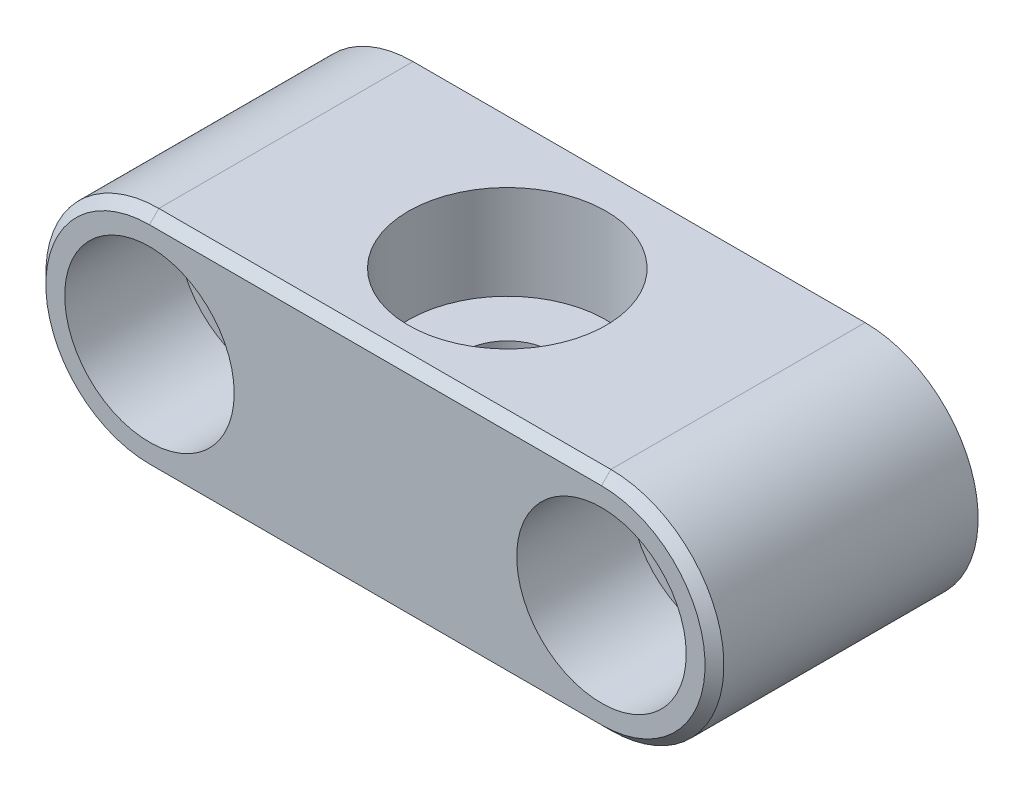
ISO-10303-21;
HEADER;
FILE_DESCRIPTION(('STEP AP214'),'2;1');
FILE_NAME('part.step','',(''),(''),'','','');
FILE_SCHEMA(('AUTOMOTIVE_DESIGN { 1 0 10303 214 1 1 1 1 }'));
ENDSEC;
DATA;
#1=APPLICATION_CONTEXT('core data for automotive mechanical design processes');
#2=APPLICATION_PROTOCOL_DEFINITION('international standard','automotive_design',2000,#1);
#3=PRODUCT_CONTEXT('',#1,'mechanical');
#4=PRODUCT('Part','Part','',(#3));
#5=PRODUCT_RELATED_PRODUCT_CATEGORY('part','',(#4));
#6=PRODUCT_DEFINITION_FORMATION('','',#4);
#7=PRODUCT_DEFINITION_CONTEXT('part definition',#1,'design');
#8=PRODUCT_DEFINITION('design','',#6,#7);
#9=PRODUCT_DEFINITION_SHAPE('','',#8);
#10=(LENGTH_UNIT() NAMED_UNIT(*) SI_UNIT(.MILLI.,.METRE.));
#11=(NAMED_UNIT(*) PLANE_ANGLE_UNIT() SI_UNIT($,.RADIAN.));
#12=(NAMED_UNIT(*) SI_UNIT($,.STERADIAN.) SOLID_ANGLE_UNIT());
#13=UNCERTAINTY_MEASURE_WITH_UNIT(LENGTH_MEASURE(1.E-05),#10,'distance_accuracy_value','');
#14=(GEOMETRIC_REPRESENTATION_CONTEXT(3) GLOBAL_UNCERTAINTY_ASSIGNED_CONTEXT((#13)) GLOBAL_UNIT_ASSIGNED_CONTEXT((#10,
#11,#12)) REPRESENTATION_CONTEXT('',''));
#15=CARTESIAN_POINT('',(0.,0.,0.));
#16=DIRECTION('',(0.,0.,1.));
#17=DIRECTION('',(1.,0.,0.));
#18=AXIS2_PLACEMENT_3D('',#15,#16,#17);
#19=CARTESIAN_POINT('',(12.,0.,7.));
#20=DIRECTION('',(0.,0.,-1.));
#21=DIRECTION('',(-1.,0.,0.));
#22=AXIS2_PLACEMENT_3D('',#19,#20,#21);
#23=CYLINDRICAL_SURFACE('',#22,2.75);
#24=CARTESIAN_POINT('',(12.,0.,-7.));
#25=DIRECTION('',(0.,0.,1.));
#26=DIRECTION('',(1.,0.,0.));
#27=AXIS2_PLACEMENT_3D('',#24,#25,#26);
#28=CIRCLE('',#27,2.75);
#29=CARTESIAN_POINT('',(14.75,0.,-7.));
#30=VERTEX_POINT('',#29);
#31=EDGE_CURVE('E111',#30,#30,#28,.T.);
#32=ORIENTED_EDGE('',*,*,#31,.F.);
#33=EDGE_LOOP('',(#32));
#34=FACE_BOUND('',#33,.T.);
#35=CARTESIAN_POINT('',(12.,0.,1.));
#36=DIRECTION('',(0.,0.,1.));
#37=DIRECTION('',(1.,0.,0.));
#38=AXIS2_PLACEMENT_3D('',#35,#36,#37);
#39=CIRCLE('',#38,2.75);
#40=CARTESIAN_POINT('',(14.75,0.,1.));
#41=VERTEX_POINT('',#40);
#42=EDGE_CURVE('E37',#41,#41,#39,.T.);
#43=ORIENTED_EDGE('',*,*,#42,.T.);
#44=EDGE_LOOP('',(#43));
#45=FACE_BOUND('',#44,.T.);
#46=ADVANCED_FACE('F33',(#34,#45),#23,.F.);
#47=CARTESIAN_POINT('',(-12.,0.,7.));
#48=DIRECTION('',(0.,0.,-1.));
#49=DIRECTION('',(-1.,0.,0.));
#50=AXIS2_PLACEMENT_3D('',#47,#48,#49);
#51=CYLINDRICAL_SURFACE('',#50,2.75);
#52=CARTESIAN_POINT('',(-12.,0.,-7.));
#53=DIRECTION('',(0.,0.,1.));
#54=DIRECTION('',(1.,0.,0.));
#55=AXIS2_PLACEMENT_3D('',#52,#53,#54);
#56=CIRCLE('',#55,2.75);
#57=CARTESIAN_POINT('',(-9.24999999999999,0.,-7.));
#58=VERTEX_POINT('',#57);
#59=EDGE_CURVE('E108',#58,#58,#56,.T.);
#60=ORIENTED_EDGE('',*,*,#59,.F.);
#61=EDGE_LOOP('',(#60));
#62=FACE_BOUND('',#61,.T.);
#63=CARTESIAN_POINT('',(-12.,0.,1.));
#64=DIRECTION('',(0.,0.,1.));
#65=DIRECTION('',(1.,0.,0.));
#66=AXIS2_PLACEMENT_3D('',#63,#64,#65);
#67=CIRCLE('',#66,2.75);
#68=CARTESIAN_POINT('',(-9.24999999999999,0.,1.));
#69=VERTEX_POINT('',#68);
#70=EDGE_CURVE('E144',#69,#69,#67,.T.);
#71=ORIENTED_EDGE('',*,*,#70,.T.);
#72=EDGE_LOOP('',(#71));
#73=FACE_BOUND('',#72,.T.);
#74=ADVANCED_FACE('F178',(#62,#73),#51,.F.);
#75=CARTESIAN_POINT('',(0.,-6.00000000000001,0.));
#76=DIRECTION('',(0.,1.,0.));
#77=DIRECTION('',(-1.,0.,0.));
#78=AXIS2_PLACEMENT_3D('',#75,#76,#77);
#79=CYLINDRICAL_SURFACE('',#78,2.35);
#80=CARTESIAN_POINT('',(0.,-6.00000000000001,0.));
#81=DIRECTION('',(0.,1.,0.));
#82=DIRECTION('',(-1.,0.,0.));
#83=AXIS2_PLACEMENT_3D('',#80,#81,#82);
#84=CIRCLE('',#83,2.35);
#85=CARTESIAN_POINT('',(-2.35,-6.00000000000001,0.));
#86=VERTEX_POINT('',#85);
#87=EDGE_CURVE('E125',#86,#86,#84,.T.);
#88=ORIENTED_EDGE('',*,*,#87,.F.);
#89=EDGE_LOOP('',(#88));
#90=FACE_BOUND('',#89,.T.);
#91=CARTESIAN_POINT('',(0.,0.999999999999999,0.));
#92=DIRECTION('',(0.,1.,0.));
#93=DIRECTION('',(-1.,0.,0.));
#94=AXIS2_PLACEMENT_3D('',#91,#92,#93);
#95=CIRCLE('',#94,2.35);
#96=CARTESIAN_POINT('',(-2.35,0.999999999999999,0.));
#97=VERTEX_POINT('',#96);
#98=EDGE_CURVE('E122',#97,#97,#95,.F.);
#99=ORIENTED_EDGE('',*,*,#98,.F.);
#100=EDGE_LOOP('',(#99));
#101=FACE_BOUND('',#100,.T.);
#102=ADVANCED_FACE('F195',(#90,#101),#79,.F.);
#103=CARTESIAN_POINT('',(12.,0.,7.));
#104=DIRECTION('',(0.,0.,1.));
#105=DIRECTION('',(1.,0.,0.));
#106=AXIS2_PLACEMENT_3D('',#103,#104,#105);
#107=PLANE('',#106);
#108=CARTESIAN_POINT('',(12.,0.,7.));
#109=DIRECTION('',(0.,0.,1.));
#110=DIRECTION('',(1.,0.,0.));
#111=AXIS2_PLACEMENT_3D('',#108,#109,#110);
#112=CIRCLE('',#111,4.5);
#113=CARTESIAN_POINT('',(16.5,0.,7.));
#114=VERTEX_POINT('',#113);
#115=EDGE_CURVE('E164',#114,#114,#112,.T.);
#116=ORIENTED_EDGE('',*,*,#115,.F.);
#117=EDGE_LOOP('',(#116));
#118=FACE_BOUND('',#117,.T.);
#119=CARTESIAN_POINT('',(-12.,0.,7.));
#120=DIRECTION('',(0.,0.,1.));
#121=DIRECTION('',(1.,0.,0.));
#122=AXIS2_PLACEMENT_3D('',#119,#120,#121);
#123=CIRCLE('',#122,4.5);
#124=CARTESIAN_POINT('',(-7.5,0.,7.));
#125=VERTEX_POINT('',#124);
#126=EDGE_CURVE('E157',#125,#125,#123,.T.);
#127=ORIENTED_EDGE('',*,*,#126,.F.);
#128=EDGE_LOOP('',(#127));
#129=FACE_BOUND('',#128,.T.);
#130=CARTESIAN_POINT('',(-12.,0.,7.));
#131=DIRECTION('',(0.,0.,1.));
#132=DIRECTION('',(1.,0.,0.));
#133=AXIS2_PLACEMENT_3D('',#130,#131,#132);
#134=CIRCLE('',#133,5.5);
#135=CARTESIAN_POINT('',(-12.,5.5,7.));
#136=VERTEX_POINT('',#135);
#137=CARTESIAN_POINT('',(-12.,-5.5,7.));
#138=VERTEX_POINT('',#137);
#139=EDGE_CURVE('E128',#136,#138,#134,.T.);
#140=ORIENTED_EDGE('',*,*,#139,.T.);
#141=DIRECTION('',(1.,0.,0.));
#142=VECTOR('',#141,1.);
#143=CARTESIAN_POINT('',(12.,-5.5,7.));
#144=LINE('',#143,#142);
#145=CARTESIAN_POINT('',(12.,-5.5,7.));
#146=VERTEX_POINT('',#145);
#147=EDGE_CURVE('E132',#138,#146,#144,.T.);
#148=ORIENTED_EDGE('',*,*,#147,.T.);
#149=CARTESIAN_POINT('',(12.,0.,7.));
#150=DIRECTION('',(0.,0.,1.));
#151=DIRECTION('',(1.,0.,0.));
#152=AXIS2_PLACEMENT_3D('',#149,#150,#151);
#153=CIRCLE('',#152,5.5);
#154=CARTESIAN_POINT('',(12.,5.50000000000001,7.));
#155=VERTEX_POINT('',#154);
#156=EDGE_CURVE('E130',#146,#155,#153,.T.);
#157=ORIENTED_EDGE('',*,*,#156,.T.);
#158=DIRECTION('',(-1.,0.,0.));
#159=VECTOR('',#158,1.);
#160=CARTESIAN_POINT('',(-12.,5.5,7.));
#161=LINE('',#160,#159);
#162=EDGE_CURVE('E92',#155,#136,#161,.T.);
#163=ORIENTED_EDGE('',*,*,#162,.T.);
#164=EDGE_LOOP('',(#140,#148,#157,#163));
#165=FACE_BOUND('',#164,.T.);
#166=ADVANCED_FACE('F192',(#118,#129,#165),#107,.T.);
#167=CARTESIAN_POINT('',(12.,0.,-7.));
#168=DIRECTION('',(0.,0.,1.));
#169=DIRECTION('',(1.,0.,0.));
#170=AXIS2_PLACEMENT_3D('',#167,#168,#169);
#171=PLANE('',#170);
#172=CARTESIAN_POINT('',(12.,0.,-7.));
#173=DIRECTION('',(0.,0.,1.));
#174=DIRECTION('',(1.,0.,0.));
#175=AXIS2_PLACEMENT_3D('',#172,#173,#174);
#176=CIRCLE('',#175,6.);
#177=CARTESIAN_POINT('',(12.,-5.99999999999999,-7.));
#178=VERTEX_POINT('',#177);
#179=CARTESIAN_POINT('',(12.,6.,-7.));
#180=VERTEX_POINT('',#179);
#181=EDGE_CURVE('E100',#178,#180,#176,.T.);
#182=ORIENTED_EDGE('',*,*,#181,.F.);
#183=DIRECTION('',(1.,0.,0.));
#184=VECTOR('',#183,1.);
#185=CARTESIAN_POINT('',(12.,-5.99999999999999,-7.));
#186=LINE('',#185,#184);
#187=CARTESIAN_POINT('',(-12.,-6.,-7.));
#188=VERTEX_POINT('',#187);
#189=EDGE_CURVE('E116',#188,#178,#186,.T.);
#190=ORIENTED_EDGE('',*,*,#189,.F.);
#191=CARTESIAN_POINT('',(-12.,0.,-7.));
#192=DIRECTION('',(0.,0.,1.));
#193=DIRECTION('',(1.,0.,0.));
#194=AXIS2_PLACEMENT_3D('',#191,#192,#193);
#195=CIRCLE('',#194,6.);
#196=CARTESIAN_POINT('',(-12.,6.,-7.));
#197=VERTEX_POINT('',#196);
#198=EDGE_CURVE('E102',#197,#188,#195,.T.);
#199=ORIENTED_EDGE('',*,*,#198,.F.);
#200=DIRECTION('',(-1.,0.,0.));
#201=VECTOR('',#200,1.);
#202=CARTESIAN_POINT('',(12.,6.,-7.));
#203=LINE('',#202,#201);
#204=EDGE_CURVE('E87',#180,#197,#203,.T.);
#205=ORIENTED_EDGE('',*,*,#204,.F.);
#206=EDGE_LOOP('',(#182,#190,#199,#205));
#207=FACE_BOUND('',#206,.T.);
#208=ORIENTED_EDGE('',*,*,#59,.T.);
#209=EDGE_LOOP('',(#208));
#210=FACE_BOUND('',#209,.T.);
#211=ORIENTED_EDGE('',*,*,#31,.T.);
#212=EDGE_LOOP('',(#211));
#213=FACE_BOUND('',#212,.T.);
#214=ADVANCED_FACE('F97',(#207,#210,#213),#171,.F.);
#215=CARTESIAN_POINT('',(12.,0.,7.));
#216=DIRECTION('',(0.,0.,-1.));
#217=DIRECTION('',(-1.,0.,0.));
#218=AXIS2_PLACEMENT_3D('',#215,#216,#217);
#219=CYLINDRICAL_SURFACE('',#218,6.);
#220=DIRECTION('',(0.,0.,-1.));
#221=VECTOR('',#220,1.);
#222=CARTESIAN_POINT('',(12.,6.,7.));
#223=LINE('',#222,#221);
#224=CARTESIAN_POINT('',(12.,6.,6.5));
#225=VERTEX_POINT('',#224);
#226=EDGE_CURVE('E84',#225,#180,#223,.T.);
#227=ORIENTED_EDGE('',*,*,#226,.F.);
#228=CARTESIAN_POINT('',(12.,0.,6.5));
#229=DIRECTION('',(0.,0.,1.));
#230=DIRECTION('',(1.,0.,0.));
#231=AXIS2_PLACEMENT_3D('',#228,#229,#230);
#232=CIRCLE('',#231,6.);
#233=CARTESIAN_POINT('',(12.,-5.99999999999999,6.5));
#234=VERTEX_POINT('',#233);
#235=EDGE_CURVE('E138',#225,#234,#232,.F.);
#236=ORIENTED_EDGE('',*,*,#235,.T.);
#237=DIRECTION('',(0.,0.,-1.));
#238=VECTOR('',#237,1.);
#239=CARTESIAN_POINT('',(12.,-5.99999999999999,7.));
#240=LINE('',#239,#238);
#241=EDGE_CURVE('E106',#234,#178,#240,.T.);
#242=ORIENTED_EDGE('',*,*,#241,.T.);
#243=ORIENTED_EDGE('',*,*,#181,.T.);
#244=EDGE_LOOP('',(#227,#236,#242,#243));
#245=FACE_BOUND('',#244,.T.);
#246=ADVANCED_FACE('F104',(#245),#219,.T.);
#247=CARTESIAN_POINT('',(12.,6.,7.));
#248=DIRECTION('',(0.,-1.,0.));
#249=DIRECTION('',(1.,0.,0.));
#250=AXIS2_PLACEMENT_3D('',#247,#248,#249);
#251=PLANE('',#250);
#252=CARTESIAN_POINT('',(0.,6.,0.));
#253=DIRECTION('',(0.,1.,0.));
#254=DIRECTION('',(-1.,0.,0.));
#255=AXIS2_PLACEMENT_3D('',#252,#253,#254);
#256=CIRCLE('',#255,5.25);
#257=CARTESIAN_POINT('',(-5.25,6.,0.));
#258=VERTEX_POINT('',#257);
#259=EDGE_CURVE('E151',#258,#258,#256,.T.);
#260=ORIENTED_EDGE('',*,*,#259,.F.);
#261=EDGE_LOOP('',(#260));
#262=FACE_BOUND('',#261,.T.);
#263=DIRECTION('',(0.,0.,-1.));
#264=VECTOR('',#263,1.);
#265=CARTESIAN_POINT('',(-12.,6.,7.));
#266=LINE('',#265,#264);
#267=CARTESIAN_POINT('',(-12.,6.,6.5));
#268=VERTEX_POINT('',#267);
#269=EDGE_CURVE('E93',#268,#197,#266,.T.);
#270=ORIENTED_EDGE('',*,*,#269,.F.);
#271=DIRECTION('',(1.,0.,0.));
#272=VECTOR('',#271,1.);
#273=CARTESIAN_POINT('',(12.,6.,6.5));
#274=LINE('',#273,#272);
#275=EDGE_CURVE('E11',#268,#225,#274,.T.);
#276=ORIENTED_EDGE('',*,*,#275,.T.);
#277=ORIENTED_EDGE('',*,*,#226,.T.);
#278=ORIENTED_EDGE('',*,*,#204,.T.);
#279=EDGE_LOOP('',(#270,#276,#277,#278));
#280=FACE_BOUND('',#279,.T.);
#281=ADVANCED_FACE('F86',(#262,#280),#251,.F.);
#282=CARTESIAN_POINT('',(-12.,0.,7.));
#283=DIRECTION('',(0.,0.,-1.));
#284=DIRECTION('',(-1.,0.,0.));
#285=AXIS2_PLACEMENT_3D('',#282,#283,#284);
#286=CYLINDRICAL_SURFACE('',#285,6.);
#287=DIRECTION('',(0.,0.,-1.));
#288=VECTOR('',#287,1.);
#289=CARTESIAN_POINT('',(-12.,-6.,7.));
#290=LINE('',#289,#288);
#291=CARTESIAN_POINT('',(-12.,-6.,6.5));
#292=VERTEX_POINT('',#291);
#293=EDGE_CURVE('E119',#292,#188,#290,.T.);
#294=ORIENTED_EDGE('',*,*,#293,.F.);
#295=CARTESIAN_POINT('',(-12.,0.,6.5));
#296=DIRECTION('',(0.,0.,1.));
#297=DIRECTION('',(1.,0.,0.));
#298=AXIS2_PLACEMENT_3D('',#295,#296,#297);
#299=CIRCLE('',#298,6.);
#300=EDGE_CURVE('E42',#292,#268,#299,.F.);
#301=ORIENTED_EDGE('',*,*,#300,.T.);
#302=ORIENTED_EDGE('',*,*,#269,.T.);
#303=ORIENTED_EDGE('',*,*,#198,.T.);
#304=EDGE_LOOP('',(#294,#301,#302,#303));
#305=FACE_BOUND('',#304,.T.);
#306=ADVANCED_FACE('F217',(#305),#286,.T.);
#307=CARTESIAN_POINT('',(12.,-5.99999999999999,7.));
#308=DIRECTION('',(0.,1.,0.));
#309=DIRECTION('',(-1.,0.,0.));
#310=AXIS2_PLACEMENT_3D('',#307,#308,#309);
#311=PLANE('',#310);
#312=ORIENTED_EDGE('',*,*,#87,.T.);
#313=EDGE_LOOP('',(#312));
#314=FACE_BOUND('',#313,.T.);
#315=ORIENTED_EDGE('',*,*,#241,.F.);
#316=DIRECTION('',(-1.,0.,0.));
#317=VECTOR('',#316,1.);
#318=CARTESIAN_POINT('',(-12.,-6.,6.5));
#319=LINE('',#318,#317);
#320=EDGE_CURVE('E135',#234,#292,#319,.T.);
#321=ORIENTED_EDGE('',*,*,#320,.T.);
#322=ORIENTED_EDGE('',*,*,#293,.T.);
#323=ORIENTED_EDGE('',*,*,#189,.T.);
#324=EDGE_LOOP('',(#315,#321,#322,#323));
#325=FACE_BOUND('',#324,.T.);
#326=ADVANCED_FACE('F216',(#314,#325),#311,.F.);
#327=CARTESIAN_POINT('',(0.,0.999999999999999,0.));
#328=DIRECTION('',(0.,1.,0.));
#329=DIRECTION('',(-1.,0.,0.));
#330=AXIS2_PLACEMENT_3D('',#327,#328,#329);
#331=PLANE('',#330);
#332=CARTESIAN_POINT('',(0.,0.999999999999999,0.));
#333=DIRECTION('',(0.,1.,0.));
#334=DIRECTION('',(-1.,0.,0.));
#335=AXIS2_PLACEMENT_3D('',#332,#333,#334);
#336=CIRCLE('',#335,5.25);
#337=CARTESIAN_POINT('',(-5.25,0.999999999999998,0.));
#338=VERTEX_POINT('',#337);
#339=EDGE_CURVE('E126',#338,#338,#336,.T.);
#340=ORIENTED_EDGE('',*,*,#339,.T.);
#341=EDGE_LOOP('',(#340));
#342=FACE_BOUND('',#341,.T.);
#343=ORIENTED_EDGE('',*,*,#98,.T.);
#344=EDGE_LOOP('',(#343));
#345=FACE_BOUND('',#344,.T.);
#346=ADVANCED_FACE('F224',(#342,#345),#331,.T.);
#347=CARTESIAN_POINT('',(0.,0.999999999999999,0.));
#348=DIRECTION('',(0.,1.,0.));
#349=DIRECTION('',(-1.,0.,0.));
#350=AXIS2_PLACEMENT_3D('',#347,#348,#349);
#351=CYLINDRICAL_SURFACE('',#350,5.25);
#352=ORIENTED_EDGE('',*,*,#339,.F.);
#353=EDGE_LOOP('',(#352));
#354=FACE_BOUND('',#353,.T.);
#355=ORIENTED_EDGE('',*,*,#259,.T.);
#356=EDGE_LOOP('',(#355));
#357=FACE_BOUND('',#356,.T.);
#358=ADVANCED_FACE('F241',(#354,#357),#351,.F.);
#359=CARTESIAN_POINT('',(12.,5.50000000000001,7.));
#360=DIRECTION('',(0.,0.70710678118655,0.707106781186545));
#361=DIRECTION('',(1.,0.,0.));
#362=AXIS2_PLACEMENT_3D('',#359,#360,#361);
#363=PLANE('',#362);
#364=DIRECTION('',(0.,-0.707106781186545,0.70710678118655));
#365=VECTOR('',#364,1.);
#366=CARTESIAN_POINT('',(12.,6.,6.5));
#367=LINE('',#366,#365);
#368=EDGE_CURVE('E146',#225,#155,#367,.T.);
#369=ORIENTED_EDGE('',*,*,#368,.F.);
#370=ORIENTED_EDGE('',*,*,#275,.F.);
#371=DIRECTION('',(0.,0.707106781186545,-0.70710678118655));
#372=VECTOR('',#371,1.);
#373=CARTESIAN_POINT('',(-12.,5.5,7.));
#374=LINE('',#373,#372);
#375=EDGE_CURVE('E149',#136,#268,#374,.T.);
#376=ORIENTED_EDGE('',*,*,#375,.F.);
#377=ORIENTED_EDGE('',*,*,#162,.F.);
#378=EDGE_LOOP('',(#369,#370,#376,#377));
#379=FACE_BOUND('',#378,.T.);
#380=ADVANCED_FACE('F35',(#379),#363,.T.);
#381=CARTESIAN_POINT('',(-12.,0.,7.));
#382=DIRECTION('',(0.,0.,-1.));
#383=DIRECTION('',(-1.,0.,0.));
#384=AXIS2_PLACEMENT_3D('',#381,#382,#383);
#385=CONICAL_SURFACE('',#384,5.5,0.785398163397445);
#386=ORIENTED_EDGE('',*,*,#375,.T.);
#387=ORIENTED_EDGE('',*,*,#300,.F.);
#388=DIRECTION('',(0.,-0.707106781186545,-0.70710678118655));
#389=VECTOR('',#388,1.);
#390=CARTESIAN_POINT('',(-12.,-5.5,7.));
#391=LINE('',#390,#389);
#392=EDGE_CURVE('E143',#138,#292,#391,.T.);
#393=ORIENTED_EDGE('',*,*,#392,.F.);
#394=ORIENTED_EDGE('',*,*,#139,.F.);
#395=EDGE_LOOP('',(#386,#387,#393,#394));
#396=FACE_BOUND('',#395,.T.);
#397=ADVANCED_FACE('F205',(#396),#385,.T.);
#398=CARTESIAN_POINT('',(12.,0.,7.));
#399=DIRECTION('',(0.,0.,-1.));
#400=DIRECTION('',(-1.,0.,0.));
#401=AXIS2_PLACEMENT_3D('',#398,#399,#400);
#402=CONICAL_SURFACE('',#401,5.5,0.785398163397445);
#403=ORIENTED_EDGE('',*,*,#368,.T.);
#404=ORIENTED_EDGE('',*,*,#156,.F.);
#405=DIRECTION('',(0.,0.707106781186545,0.70710678118655));
#406=VECTOR('',#405,1.);
#407=CARTESIAN_POINT('',(12.,-5.99999999999999,6.5));
#408=LINE('',#407,#406);
#409=EDGE_CURVE('E141',#234,#146,#408,.T.);
#410=ORIENTED_EDGE('',*,*,#409,.F.);
#411=ORIENTED_EDGE('',*,*,#235,.F.);
#412=EDGE_LOOP('',(#403,#404,#410,#411));
#413=FACE_BOUND('',#412,.T.);
#414=ADVANCED_FACE('F213',(#413),#402,.T.);
#415=CARTESIAN_POINT('',(12.,-5.5,7.));
#416=DIRECTION('',(0.,-0.70710678118655,0.707106781186545));
#417=DIRECTION('',(-1.,0.,0.));
#418=AXIS2_PLACEMENT_3D('',#415,#416,#417);
#419=PLANE('',#418);
#420=ORIENTED_EDGE('',*,*,#392,.T.);
#421=ORIENTED_EDGE('',*,*,#320,.F.);
#422=ORIENTED_EDGE('',*,*,#409,.T.);
#423=ORIENTED_EDGE('',*,*,#147,.F.);
#424=EDGE_LOOP('',(#420,#421,#422,#423));
#425=FACE_BOUND('',#424,.T.);
#426=ADVANCED_FACE('F208',(#425),#419,.T.);
#427=CARTESIAN_POINT('',(-12.,0.,1.));
#428=DIRECTION('',(0.,0.,1.));
#429=DIRECTION('',(1.,0.,0.));
#430=AXIS2_PLACEMENT_3D('',#427,#428,#429);
#431=CYLINDRICAL_SURFACE('',#430,4.5);
#432=CARTESIAN_POINT('',(-12.,0.,1.));
#433=DIRECTION('',(0.,0.,1.));
#434=DIRECTION('',(1.,0.,0.));
#435=AXIS2_PLACEMENT_3D('',#432,#433,#434);
#436=CIRCLE('',#435,4.5);
#437=CARTESIAN_POINT('',(-7.5,0.,1.));
#438=VERTEX_POINT('',#437);
#439=EDGE_CURVE('E153',#438,#438,#436,.T.);
#440=ORIENTED_EDGE('',*,*,#439,.F.);
#441=EDGE_LOOP('',(#440));
#442=FACE_BOUND('',#441,.T.);
#443=ORIENTED_EDGE('',*,*,#126,.T.);
#444=EDGE_LOOP('',(#443));
#445=FACE_BOUND('',#444,.T.);
#446=ADVANCED_FACE('F235',(#442,#445),#431,.F.);
#447=CARTESIAN_POINT('',(-12.,0.,1.));
#448=DIRECTION('',(0.,0.,1.));
#449=DIRECTION('',(1.,0.,0.));
#450=AXIS2_PLACEMENT_3D('',#447,#448,#449);
#451=PLANE('',#450);
#452=ORIENTED_EDGE('',*,*,#70,.F.);
#453=EDGE_LOOP('',(#452));
#454=FACE_BOUND('',#453,.T.);
#455=ORIENTED_EDGE('',*,*,#439,.T.);
#456=EDGE_LOOP('',(#455));
#457=FACE_BOUND('',#456,.T.);
#458=ADVANCED_FACE('F328',(#454,#457),#451,.T.);
#459=CARTESIAN_POINT('',(12.,0.,1.));
#460=DIRECTION('',(0.,0.,1.));
#461=DIRECTION('',(1.,0.,0.));
#462=AXIS2_PLACEMENT_3D('',#459,#460,#461);
#463=CYLINDRICAL_SURFACE('',#462,4.5);
#464=CARTESIAN_POINT('',(12.,0.,1.));
#465=DIRECTION('',(0.,0.,1.));
#466=DIRECTION('',(1.,0.,0.));
#467=AXIS2_PLACEMENT_3D('',#464,#465,#466);
#468=CIRCLE('',#467,4.5);
#469=CARTESIAN_POINT('',(16.5,0.,1.));
#470=VERTEX_POINT('',#469);
#471=EDGE_CURVE('E183',#470,#470,#468,.T.);
#472=ORIENTED_EDGE('',*,*,#471,.F.);
#473=EDGE_LOOP('',(#472));
#474=FACE_BOUND('',#473,.T.);
#475=ORIENTED_EDGE('',*,*,#115,.T.);
#476=EDGE_LOOP('',(#475));
#477=FACE_BOUND('',#476,.T.);
#478=ADVANCED_FACE('F190',(#474,#477),#463,.F.);
#479=CARTESIAN_POINT('',(12.,0.,1.));
#480=DIRECTION('',(0.,0.,1.));
#481=DIRECTION('',(1.,0.,0.));
#482=AXIS2_PLACEMENT_3D('',#479,#480,#481);
#483=PLANE('',#482);
#484=ORIENTED_EDGE('',*,*,#42,.F.);
#485=EDGE_LOOP('',(#484));
#486=FACE_BOUND('',#485,.T.);
#487=ORIENTED_EDGE('',*,*,#471,.T.);
#488=EDGE_LOOP('',(#487));
#489=FACE_BOUND('',#488,.T.);
#490=ADVANCED_FACE('F346',(#486,#489),#483,.T.);
#491=CLOSED_SHELL('',(#46,#74,#102,#166,#214,#246,#281,#306,#326,#346,#358,#380,#397,#414,#426,
#446,#458,#478,#490));
#492=MANIFOLD_SOLID_BREP('B2',#491);
#493=ADVANCED_BREP_SHAPE_REPRESENTATION('',(#18,#492),#14);
#494=SHAPE_DEFINITION_REPRESENTATION(#9,#493);
ENDSEC;
END-ISO-10303-21;
